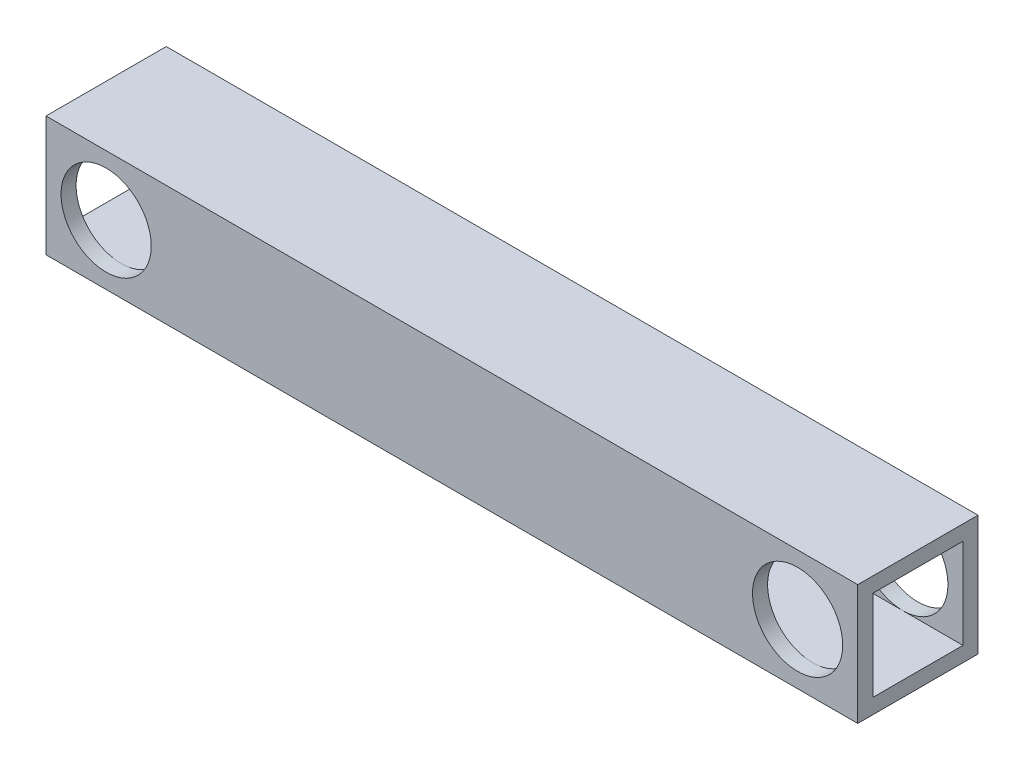
ISO-10303-21;
HEADER;
FILE_DESCRIPTION(('STEP AP214'),'2;1');
FILE_NAME('part.step','',(''),(''),'','','');
FILE_SCHEMA(('AUTOMOTIVE_DESIGN { 1 0 10303 214 1 1 1 1 }'));
ENDSEC;
DATA;
#1=APPLICATION_CONTEXT('core data for automotive mechanical design processes');
#2=APPLICATION_PROTOCOL_DEFINITION('international standard','automotive_design',2000,#1);
#3=PRODUCT_CONTEXT('',#1,'mechanical');
#4=PRODUCT('Part','Part','',(#3));
#5=PRODUCT_RELATED_PRODUCT_CATEGORY('part','',(#4));
#6=PRODUCT_DEFINITION_FORMATION('','',#4);
#7=PRODUCT_DEFINITION_CONTEXT('part definition',#1,'design');
#8=PRODUCT_DEFINITION('design','',#6,#7);
#9=PRODUCT_DEFINITION_SHAPE('','',#8);
#10=(LENGTH_UNIT() NAMED_UNIT(*) SI_UNIT(.MILLI.,.METRE.));
#11=(NAMED_UNIT(*) PLANE_ANGLE_UNIT() SI_UNIT($,.RADIAN.));
#12=(NAMED_UNIT(*) SI_UNIT($,.STERADIAN.) SOLID_ANGLE_UNIT());
#13=UNCERTAINTY_MEASURE_WITH_UNIT(LENGTH_MEASURE(1.E-05),#10,'distance_accuracy_value','');
#14=(GEOMETRIC_REPRESENTATION_CONTEXT(3) GLOBAL_UNCERTAINTY_ASSIGNED_CONTEXT((#13)) GLOBAL_UNIT_ASSIGNED_CONTEXT((#10,
#11,#12)) REPRESENTATION_CONTEXT('',''));
#15=CARTESIAN_POINT('',(0.,0.,0.));
#16=DIRECTION('',(0.,0.,1.));
#17=DIRECTION('',(1.,0.,0.));
#18=AXIS2_PLACEMENT_3D('',#15,#16,#17);
#19=CARTESIAN_POINT('',(0.,0.,25.4));
#20=DIRECTION('',(0.,0.,-1.));
#21=DIRECTION('',(-1.,0.,0.));
#22=AXIS2_PLACEMENT_3D('',#19,#20,#21);
#23=CYLINDRICAL_SURFACE('',#22,9.525);
#24=CARTESIAN_POINT('',(0.,0.,22.225));
#25=DIRECTION('',(0.,0.,1.));
#26=DIRECTION('',(1.,0.,0.));
#27=AXIS2_PLACEMENT_3D('',#24,#25,#26);
#28=CIRCLE('',#27,9.525);
#29=CARTESIAN_POINT('',(0.,9.525,22.225));
#30=VERTEX_POINT('',#29);
#31=CARTESIAN_POINT('',(0.,-9.525,22.225));
#32=VERTEX_POINT('',#31);
#33=EDGE_CURVE('E175',#30,#32,#28,.T.);
#34=ORIENTED_EDGE('',*,*,#33,.F.);
#35=EDGE_CURVE('E173',#32,#30,#28,.T.);
#36=ORIENTED_EDGE('',*,*,#35,.F.);
#37=EDGE_LOOP('',(#34,#36));
#38=FACE_BOUND('',#37,.T.);
#39=CARTESIAN_POINT('',(0.,0.,25.4));
#40=DIRECTION('',(0.,0.,1.));
#41=DIRECTION('',(1.,0.,0.));
#42=AXIS2_PLACEMENT_3D('',#39,#40,#41);
#43=CIRCLE('',#42,9.525);
#44=CARTESIAN_POINT('',(9.525,0.,25.4));
#45=VERTEX_POINT('',#44);
#46=EDGE_CURVE('E183',#45,#45,#43,.T.);
#47=ORIENTED_EDGE('',*,*,#46,.T.);
#48=EDGE_LOOP('',(#47));
#49=FACE_BOUND('',#48,.T.);
#50=ADVANCED_FACE('F33',(#38,#49),#23,.F.);
#51=CARTESIAN_POINT('',(146.05,0.,25.4));
#52=DIRECTION('',(0.,0.,-1.));
#53=DIRECTION('',(-1.,0.,0.));
#54=AXIS2_PLACEMENT_3D('',#51,#52,#53);
#55=CYLINDRICAL_SURFACE('',#54,9.525);
#56=CARTESIAN_POINT('',(146.05,0.,22.225));
#57=DIRECTION('',(0.,0.,1.));
#58=DIRECTION('',(1.,0.,0.));
#59=AXIS2_PLACEMENT_3D('',#56,#57,#58);
#60=CIRCLE('',#59,9.525);
#61=CARTESIAN_POINT('',(146.05,9.525,22.225));
#62=VERTEX_POINT('',#61);
#63=CARTESIAN_POINT('',(146.05,-9.525,22.225));
#64=VERTEX_POINT('',#63);
#65=EDGE_CURVE('E11',#62,#64,#60,.T.);
#66=ORIENTED_EDGE('',*,*,#65,.F.);
#67=EDGE_CURVE('E37',#64,#62,#60,.T.);
#68=ORIENTED_EDGE('',*,*,#67,.F.);
#69=EDGE_LOOP('',(#66,#68));
#70=FACE_BOUND('',#69,.T.);
#71=CARTESIAN_POINT('',(146.05,0.,25.4));
#72=DIRECTION('',(0.,0.,1.));
#73=DIRECTION('',(1.,0.,0.));
#74=AXIS2_PLACEMENT_3D('',#71,#72,#73);
#75=CIRCLE('',#74,9.525);
#76=CARTESIAN_POINT('',(155.575,0.,25.4));
#77=VERTEX_POINT('',#76);
#78=EDGE_CURVE('E176',#77,#77,#75,.T.);
#79=ORIENTED_EDGE('',*,*,#78,.T.);
#80=EDGE_LOOP('',(#79));
#81=FACE_BOUND('',#80,.T.);
#82=ADVANCED_FACE('F242',(#70,#81),#55,.F.);
#83=CARTESIAN_POINT('',(0.,0.,25.4));
#84=DIRECTION('',(0.,0.,-1.));
#85=DIRECTION('',(-1.,0.,0.));
#86=AXIS2_PLACEMENT_3D('',#83,#84,#85);
#87=PLANE('',#86);
#88=ORIENTED_EDGE('',*,*,#46,.F.);
#89=EDGE_LOOP('',(#88));
#90=FACE_BOUND('',#89,.T.);
#91=DIRECTION('',(0.,1.,0.));
#92=VECTOR('',#91,1.);
#93=CARTESIAN_POINT('',(158.75,12.7,25.4));
#94=LINE('',#93,#92);
#95=CARTESIAN_POINT('',(158.75,-12.7,25.4));
#96=VERTEX_POINT('',#95);
#97=CARTESIAN_POINT('',(158.75,12.7,25.4));
#98=VERTEX_POINT('',#97);
#99=EDGE_CURVE('E189',#96,#98,#94,.T.);
#100=ORIENTED_EDGE('',*,*,#99,.T.);
#101=DIRECTION('',(-1.,0.,0.));
#102=VECTOR('',#101,1.);
#103=CARTESIAN_POINT('',(158.75,12.7,25.4));
#104=LINE('',#103,#102);
#105=CARTESIAN_POINT('',(-12.7,12.7,25.4));
#106=VERTEX_POINT('',#105);
#107=EDGE_CURVE('E192',#98,#106,#104,.T.);
#108=ORIENTED_EDGE('',*,*,#107,.T.);
#109=DIRECTION('',(0.,-1.,0.));
#110=VECTOR('',#109,1.);
#111=CARTESIAN_POINT('',(-12.7,12.7,25.4));
#112=LINE('',#111,#110);
#113=CARTESIAN_POINT('',(-12.7,-12.7,25.4));
#114=VERTEX_POINT('',#113);
#115=EDGE_CURVE('E195',#106,#114,#112,.T.);
#116=ORIENTED_EDGE('',*,*,#115,.T.);
#117=DIRECTION('',(1.,0.,0.));
#118=VECTOR('',#117,1.);
#119=CARTESIAN_POINT('',(158.75,-12.7,25.4));
#120=LINE('',#119,#118);
#121=EDGE_CURVE('E197',#114,#96,#120,.T.);
#122=ORIENTED_EDGE('',*,*,#121,.T.);
#123=EDGE_LOOP('',(#100,#108,#116,#122));
#124=FACE_BOUND('',#123,.T.);
#125=ORIENTED_EDGE('',*,*,#78,.F.);
#126=EDGE_LOOP('',(#125));
#127=FACE_BOUND('',#126,.T.);
#128=ADVANCED_FACE('F245',(#90,#124,#127),#87,.F.);
#129=CARTESIAN_POINT('',(0.,0.,0.));
#130=DIRECTION('',(0.,0.,-1.));
#131=DIRECTION('',(-1.,0.,0.));
#132=AXIS2_PLACEMENT_3D('',#129,#130,#131);
#133=PLANE('',#132);
#134=CARTESIAN_POINT('',(0.,0.,0.));
#135=DIRECTION('',(0.,0.,1.));
#136=DIRECTION('',(1.,0.,0.));
#137=AXIS2_PLACEMENT_3D('',#134,#135,#136);
#138=CIRCLE('',#137,9.525);
#139=CARTESIAN_POINT('',(9.525,0.,0.));
#140=VERTEX_POINT('',#139);
#141=EDGE_CURVE('E179',#140,#140,#138,.T.);
#142=ORIENTED_EDGE('',*,*,#141,.T.);
#143=EDGE_LOOP('',(#142));
#144=FACE_BOUND('',#143,.T.);
#145=DIRECTION('',(0.,1.,0.));
#146=VECTOR('',#145,1.);
#147=CARTESIAN_POINT('',(158.75,12.7,0.));
#148=LINE('',#147,#146);
#149=CARTESIAN_POINT('',(158.75,-12.7,0.));
#150=VERTEX_POINT('',#149);
#151=CARTESIAN_POINT('',(158.75,12.7,0.));
#152=VERTEX_POINT('',#151);
#153=EDGE_CURVE('E186',#150,#152,#148,.T.);
#154=ORIENTED_EDGE('',*,*,#153,.F.);
#155=DIRECTION('',(1.,0.,0.));
#156=VECTOR('',#155,1.);
#157=CARTESIAN_POINT('',(158.75,-12.7,0.));
#158=LINE('',#157,#156);
#159=CARTESIAN_POINT('',(-12.7,-12.7,0.));
#160=VERTEX_POINT('',#159);
#161=EDGE_CURVE('E193',#160,#150,#158,.T.);
#162=ORIENTED_EDGE('',*,*,#161,.F.);
#163=DIRECTION('',(0.,-1.,0.));
#164=VECTOR('',#163,1.);
#165=CARTESIAN_POINT('',(-12.7,12.7,0.));
#166=LINE('',#165,#164);
#167=CARTESIAN_POINT('',(-12.7,12.7,0.));
#168=VERTEX_POINT('',#167);
#169=EDGE_CURVE('E204',#168,#160,#166,.T.);
#170=ORIENTED_EDGE('',*,*,#169,.F.);
#171=DIRECTION('',(-1.,0.,0.));
#172=VECTOR('',#171,1.);
#173=CARTESIAN_POINT('',(158.75,12.7,0.));
#174=LINE('',#173,#172);
#175=EDGE_CURVE('E202',#152,#168,#174,.T.);
#176=ORIENTED_EDGE('',*,*,#175,.F.);
#177=EDGE_LOOP('',(#154,#162,#170,#176));
#178=FACE_BOUND('',#177,.T.);
#179=CARTESIAN_POINT('',(146.05,0.,0.));
#180=DIRECTION('',(0.,0.,1.));
#181=DIRECTION('',(1.,0.,0.));
#182=AXIS2_PLACEMENT_3D('',#179,#180,#181);
#183=CIRCLE('',#182,9.525);
#184=CARTESIAN_POINT('',(155.575,0.,0.));
#185=VERTEX_POINT('',#184);
#186=EDGE_CURVE('E180',#185,#185,#183,.T.);
#187=ORIENTED_EDGE('',*,*,#186,.T.);
#188=EDGE_LOOP('',(#187));
#189=FACE_BOUND('',#188,.T.);
#190=ADVANCED_FACE('F251',(#144,#178,#189),#133,.T.);
#191=CARTESIAN_POINT('',(158.75,12.7,25.4));
#192=DIRECTION('',(-1.,0.,0.));
#193=DIRECTION('',(0.,0.,1.));
#194=AXIS2_PLACEMENT_3D('',#191,#192,#193);
#195=PLANE('',#194);
#196=DIRECTION('',(0.,1.,0.));
#197=VECTOR('',#196,1.);
#198=CARTESIAN_POINT('',(158.75,-9.525,3.175));
#199=LINE('',#198,#197);
#200=CARTESIAN_POINT('',(158.75,-9.525,3.175));
#201=VERTEX_POINT('',#200);
#202=CARTESIAN_POINT('',(158.75,9.525,3.175));
#203=VERTEX_POINT('',#202);
#204=EDGE_CURVE('E154',#201,#203,#199,.T.);
#205=ORIENTED_EDGE('',*,*,#204,.F.);
#206=DIRECTION('',(0.,0.,-1.));
#207=VECTOR('',#206,1.);
#208=CARTESIAN_POINT('',(158.75,-9.525,22.225));
#209=LINE('',#208,#207);
#210=CARTESIAN_POINT('',(158.75,-9.525,22.225));
#211=VERTEX_POINT('',#210);
#212=EDGE_CURVE('E48',#211,#201,#209,.T.);
#213=ORIENTED_EDGE('',*,*,#212,.F.);
#214=DIRECTION('',(0.,-1.,0.));
#215=VECTOR('',#214,1.);
#216=CARTESIAN_POINT('',(158.75,9.525,22.225));
#217=LINE('',#216,#215);
#218=CARTESIAN_POINT('',(158.75,9.525,22.225));
#219=VERTEX_POINT('',#218);
#220=EDGE_CURVE('E145',#219,#211,#217,.T.);
#221=ORIENTED_EDGE('',*,*,#220,.F.);
#222=DIRECTION('',(0.,0.,1.));
#223=VECTOR('',#222,1.);
#224=CARTESIAN_POINT('',(158.75,9.525,3.175));
#225=LINE('',#224,#223);
#226=EDGE_CURVE('E148',#203,#219,#225,.T.);
#227=ORIENTED_EDGE('',*,*,#226,.F.);
#228=EDGE_LOOP('',(#205,#213,#221,#227));
#229=FACE_BOUND('',#228,.T.);
#230=ORIENTED_EDGE('',*,*,#153,.T.);
#231=DIRECTION('',(0.,0.,-1.));
#232=VECTOR('',#231,1.);
#233=CARTESIAN_POINT('',(158.75,12.7,25.4));
#234=LINE('',#233,#232);
#235=EDGE_CURVE('E215',#98,#152,#234,.T.);
#236=ORIENTED_EDGE('',*,*,#235,.F.);
#237=ORIENTED_EDGE('',*,*,#99,.F.);
#238=DIRECTION('',(0.,0.,-1.));
#239=VECTOR('',#238,1.);
#240=CARTESIAN_POINT('',(158.75,-12.7,25.4));
#241=LINE('',#240,#239);
#242=EDGE_CURVE('E199',#96,#150,#241,.T.);
#243=ORIENTED_EDGE('',*,*,#242,.T.);
#244=EDGE_LOOP('',(#230,#236,#237,#243));
#245=FACE_BOUND('',#244,.T.);
#246=ADVANCED_FACE('F35',(#229,#245),#195,.F.);
#247=CARTESIAN_POINT('',(158.75,12.7,25.4));
#248=DIRECTION('',(0.,-1.,0.));
#249=DIRECTION('',(1.,0.,0.));
#250=AXIS2_PLACEMENT_3D('',#247,#248,#249);
#251=PLANE('',#250);
#252=ORIENTED_EDGE('',*,*,#175,.T.);
#253=DIRECTION('',(0.,0.,-1.));
#254=VECTOR('',#253,1.);
#255=CARTESIAN_POINT('',(-12.7,12.7,25.4));
#256=LINE('',#255,#254);
#257=EDGE_CURVE('E212',#106,#168,#256,.T.);
#258=ORIENTED_EDGE('',*,*,#257,.F.);
#259=ORIENTED_EDGE('',*,*,#107,.F.);
#260=ORIENTED_EDGE('',*,*,#235,.T.);
#261=EDGE_LOOP('',(#252,#258,#259,#260));
#262=FACE_BOUND('',#261,.T.);
#263=ADVANCED_FACE('F299',(#262),#251,.F.);
#264=CARTESIAN_POINT('',(-12.7,12.7,25.4));
#265=DIRECTION('',(1.,0.,0.));
#266=DIRECTION('',(0.,0.,-1.));
#267=AXIS2_PLACEMENT_3D('',#264,#265,#266);
#268=PLANE('',#267);
#269=DIRECTION('',(0.,-1.,0.));
#270=VECTOR('',#269,1.);
#271=CARTESIAN_POINT('',(-12.7,9.525,22.225));
#272=LINE('',#271,#270);
#273=CARTESIAN_POINT('',(-12.7,9.525,22.225));
#274=VERTEX_POINT('',#273);
#275=CARTESIAN_POINT('',(-12.7,-9.525,22.225));
#276=VERTEX_POINT('',#275);
#277=EDGE_CURVE('E144',#274,#276,#272,.T.);
#278=ORIENTED_EDGE('',*,*,#277,.T.);
#279=DIRECTION('',(0.,0.,-1.));
#280=VECTOR('',#279,1.);
#281=CARTESIAN_POINT('',(-12.7,-9.525,22.225));
#282=LINE('',#281,#280);
#283=CARTESIAN_POINT('',(-12.7,-9.525,3.175));
#284=VERTEX_POINT('',#283);
#285=EDGE_CURVE('E127',#276,#284,#282,.T.);
#286=ORIENTED_EDGE('',*,*,#285,.T.);
#287=DIRECTION('',(0.,1.,0.));
#288=VECTOR('',#287,1.);
#289=CARTESIAN_POINT('',(-12.7,-9.525,3.175));
#290=LINE('',#289,#288);
#291=CARTESIAN_POINT('',(-12.7,9.525,3.175));
#292=VERTEX_POINT('',#291);
#293=EDGE_CURVE('E136',#284,#292,#290,.T.);
#294=ORIENTED_EDGE('',*,*,#293,.T.);
#295=DIRECTION('',(0.,0.,1.));
#296=VECTOR('',#295,1.);
#297=CARTESIAN_POINT('',(-12.7,9.525,3.175));
#298=LINE('',#297,#296);
#299=EDGE_CURVE('E56',#292,#274,#298,.T.);
#300=ORIENTED_EDGE('',*,*,#299,.T.);
#301=EDGE_LOOP('',(#278,#286,#294,#300));
#302=FACE_BOUND('',#301,.T.);
#303=ORIENTED_EDGE('',*,*,#169,.T.);
#304=DIRECTION('',(0.,0.,-1.));
#305=VECTOR('',#304,1.);
#306=CARTESIAN_POINT('',(-12.7,-12.7,25.4));
#307=LINE('',#306,#305);
#308=EDGE_CURVE('E209',#114,#160,#307,.T.);
#309=ORIENTED_EDGE('',*,*,#308,.F.);
#310=ORIENTED_EDGE('',*,*,#115,.F.);
#311=ORIENTED_EDGE('',*,*,#257,.T.);
#312=EDGE_LOOP('',(#303,#309,#310,#311));
#313=FACE_BOUND('',#312,.T.);
#314=ADVANCED_FACE('F141',(#302,#313),#268,.F.);
#315=CARTESIAN_POINT('',(158.75,-12.7,25.4));
#316=DIRECTION('',(0.,1.,0.));
#317=DIRECTION('',(-1.,0.,0.));
#318=AXIS2_PLACEMENT_3D('',#315,#316,#317);
#319=PLANE('',#318);
#320=ORIENTED_EDGE('',*,*,#161,.T.);
#321=ORIENTED_EDGE('',*,*,#242,.F.);
#322=ORIENTED_EDGE('',*,*,#121,.F.);
#323=ORIENTED_EDGE('',*,*,#308,.T.);
#324=EDGE_LOOP('',(#320,#321,#322,#323));
#325=FACE_BOUND('',#324,.T.);
#326=ADVANCED_FACE('F270',(#325),#319,.F.);
#327=CARTESIAN_POINT('',(0.,0.,3.175));
#328=DIRECTION('',(0.,0.,-1.));
#329=DIRECTION('',(-1.,0.,0.));
#330=AXIS2_PLACEMENT_3D('',#327,#328,#329);
#331=CIRCLE('',#330,9.525);
#332=CARTESIAN_POINT('',(0.,9.525,3.175));
#333=VERTEX_POINT('',#332);
#334=CARTESIAN_POINT('',(0.,-9.525,3.175));
#335=VERTEX_POINT('',#334);
#336=EDGE_CURVE('E172',#333,#335,#331,.T.);
#337=ORIENTED_EDGE('',*,*,#336,.F.);
#338=EDGE_CURVE('E161',#335,#333,#331,.T.);
#339=ORIENTED_EDGE('',*,*,#338,.F.);
#340=EDGE_LOOP('',(#337,#339));
#341=FACE_BOUND('',#340,.T.);
#342=ORIENTED_EDGE('',*,*,#141,.F.);
#343=EDGE_LOOP('',(#342));
#344=FACE_BOUND('',#343,.T.);
#345=ADVANCED_FACE('F264',(#341,#344),#23,.F.);
#346=CARTESIAN_POINT('',(146.05,0.,3.175));
#347=DIRECTION('',(0.,0.,-1.));
#348=DIRECTION('',(-1.,0.,0.));
#349=AXIS2_PLACEMENT_3D('',#346,#347,#348);
#350=CIRCLE('',#349,9.525);
#351=CARTESIAN_POINT('',(146.05,9.525,3.175));
#352=VERTEX_POINT('',#351);
#353=CARTESIAN_POINT('',(146.05,-9.525,3.175));
#354=VERTEX_POINT('',#353);
#355=EDGE_CURVE('E218',#352,#354,#350,.T.);
#356=ORIENTED_EDGE('',*,*,#355,.F.);
#357=EDGE_CURVE('E217',#354,#352,#350,.T.);
#358=ORIENTED_EDGE('',*,*,#357,.F.);
#359=EDGE_LOOP('',(#356,#358));
#360=FACE_BOUND('',#359,.T.);
#361=ORIENTED_EDGE('',*,*,#186,.F.);
#362=EDGE_LOOP('',(#361));
#363=FACE_BOUND('',#362,.T.);
#364=ADVANCED_FACE('F247',(#360,#363),#55,.F.);
#365=CARTESIAN_POINT('',(-12.7,-9.525,22.225));
#366=DIRECTION('',(0.,-1.,0.));
#367=DIRECTION('',(0.,0.,-1.));
#368=AXIS2_PLACEMENT_3D('',#365,#366,#367);
#369=PLANE('',#368);
#370=DIRECTION('',(1.,0.,0.));
#371=VECTOR('',#370,1.);
#372=CARTESIAN_POINT('',(-12.7,-9.525,22.225));
#373=LINE('',#372,#371);
#374=EDGE_CURVE('E162',#32,#64,#373,.T.);
#375=ORIENTED_EDGE('',*,*,#374,.T.);
#376=EDGE_CURVE('E163',#64,#211,#373,.T.);
#377=ORIENTED_EDGE('',*,*,#376,.T.);
#378=ORIENTED_EDGE('',*,*,#212,.T.);
#379=DIRECTION('',(1.,0.,0.));
#380=VECTOR('',#379,1.);
#381=CARTESIAN_POINT('',(-12.7,-9.525,3.175));
#382=LINE('',#381,#380);
#383=EDGE_CURVE('E134',#354,#201,#382,.T.);
#384=ORIENTED_EDGE('',*,*,#383,.F.);
#385=EDGE_CURVE('E129',#335,#354,#382,.T.);
#386=ORIENTED_EDGE('',*,*,#385,.F.);
#387=EDGE_CURVE('E123',#284,#335,#382,.T.);
#388=ORIENTED_EDGE('',*,*,#387,.F.);
#389=ORIENTED_EDGE('',*,*,#285,.F.);
#390=EDGE_CURVE('E159',#276,#32,#373,.T.);
#391=ORIENTED_EDGE('',*,*,#390,.T.);
#392=EDGE_LOOP('',(#375,#377,#378,#384,#386,#388,#389,#391));
#393=FACE_BOUND('',#392,.T.);
#394=ADVANCED_FACE('F125',(#393),#369,.F.);
#395=CARTESIAN_POINT('',(-12.7,9.525,22.225));
#396=DIRECTION('',(0.,0.,1.));
#397=DIRECTION('',(1.,0.,0.));
#398=AXIS2_PLACEMENT_3D('',#395,#396,#397);
#399=PLANE('',#398);
#400=ORIENTED_EDGE('',*,*,#33,.T.);
#401=ORIENTED_EDGE('',*,*,#390,.F.);
#402=ORIENTED_EDGE('',*,*,#277,.F.);
#403=DIRECTION('',(1.,0.,0.));
#404=VECTOR('',#403,1.);
#405=CARTESIAN_POINT('',(-12.7,9.525,22.225));
#406=LINE('',#405,#404);
#407=EDGE_CURVE('E164',#274,#30,#406,.T.);
#408=ORIENTED_EDGE('',*,*,#407,.T.);
#409=EDGE_LOOP('',(#400,#401,#402,#408));
#410=FACE_BOUND('',#409,.T.);
#411=ADVANCED_FACE('F326',(#410),#399,.F.);
#412=ORIENTED_EDGE('',*,*,#35,.T.);
#413=EDGE_CURVE('E167',#30,#62,#406,.T.);
#414=ORIENTED_EDGE('',*,*,#413,.T.);
#415=ORIENTED_EDGE('',*,*,#65,.T.);
#416=ORIENTED_EDGE('',*,*,#374,.F.);
#417=EDGE_LOOP('',(#412,#414,#415,#416));
#418=FACE_BOUND('',#417,.T.);
#419=ADVANCED_FACE('F239',(#418),#399,.F.);
#420=CARTESIAN_POINT('',(-12.7,9.525,3.175));
#421=DIRECTION('',(0.,1.,0.));
#422=DIRECTION('',(0.,0.,1.));
#423=AXIS2_PLACEMENT_3D('',#420,#421,#422);
#424=PLANE('',#423);
#425=ORIENTED_EDGE('',*,*,#407,.F.);
#426=ORIENTED_EDGE('',*,*,#299,.F.);
#427=DIRECTION('',(1.,0.,0.));
#428=VECTOR('',#427,1.);
#429=CARTESIAN_POINT('',(-12.7,9.525,3.175));
#430=LINE('',#429,#428);
#431=EDGE_CURVE('E138',#292,#333,#430,.T.);
#432=ORIENTED_EDGE('',*,*,#431,.T.);
#433=EDGE_CURVE('E169',#333,#352,#430,.T.);
#434=ORIENTED_EDGE('',*,*,#433,.T.);
#435=EDGE_CURVE('E132',#352,#203,#430,.T.);
#436=ORIENTED_EDGE('',*,*,#435,.T.);
#437=ORIENTED_EDGE('',*,*,#226,.T.);
#438=EDGE_CURVE('E168',#62,#219,#406,.T.);
#439=ORIENTED_EDGE('',*,*,#438,.F.);
#440=ORIENTED_EDGE('',*,*,#413,.F.);
#441=EDGE_LOOP('',(#425,#426,#432,#434,#436,#437,#439,#440));
#442=FACE_BOUND('',#441,.T.);
#443=ADVANCED_FACE('F235',(#442),#424,.F.);
#444=CARTESIAN_POINT('',(-12.7,-9.525,3.175));
#445=DIRECTION('',(0.,0.,-1.));
#446=DIRECTION('',(-1.,0.,0.));
#447=AXIS2_PLACEMENT_3D('',#444,#445,#446);
#448=PLANE('',#447);
#449=ORIENTED_EDGE('',*,*,#336,.T.);
#450=ORIENTED_EDGE('',*,*,#385,.T.);
#451=ORIENTED_EDGE('',*,*,#357,.T.);
#452=ORIENTED_EDGE('',*,*,#433,.F.);
#453=EDGE_LOOP('',(#449,#450,#451,#452));
#454=FACE_BOUND('',#453,.T.);
#455=ADVANCED_FACE('F312',(#454),#448,.F.);
#456=ORIENTED_EDGE('',*,*,#355,.T.);
#457=ORIENTED_EDGE('',*,*,#383,.T.);
#458=ORIENTED_EDGE('',*,*,#204,.T.);
#459=ORIENTED_EDGE('',*,*,#435,.F.);
#460=EDGE_LOOP('',(#456,#457,#458,#459));
#461=FACE_BOUND('',#460,.T.);
#462=ADVANCED_FACE('F310',(#461),#448,.F.);
#463=ORIENTED_EDGE('',*,*,#67,.T.);
#464=ORIENTED_EDGE('',*,*,#438,.T.);
#465=ORIENTED_EDGE('',*,*,#220,.T.);
#466=ORIENTED_EDGE('',*,*,#376,.F.);
#467=EDGE_LOOP('',(#463,#464,#465,#466));
#468=FACE_BOUND('',#467,.T.);
#469=ADVANCED_FACE('F230',(#468),#399,.F.);
#470=ORIENTED_EDGE('',*,*,#338,.T.);
#471=ORIENTED_EDGE('',*,*,#431,.F.);
#472=ORIENTED_EDGE('',*,*,#293,.F.);
#473=ORIENTED_EDGE('',*,*,#387,.T.);
#474=EDGE_LOOP('',(#470,#471,#472,#473));
#475=FACE_BOUND('',#474,.T.);
#476=ADVANCED_FACE('F137',(#475),#448,.F.);
#477=CLOSED_SHELL('',(#50,#82,#128,#190,#246,#263,#314,#326,#345,#364,#394,#411,#419,#443,#455,
#462,#469,#476));
#478=MANIFOLD_SOLID_BREP('B2',#477);
#479=ADVANCED_BREP_SHAPE_REPRESENTATION('',(#18,#478),#14);
#480=SHAPE_DEFINITION_REPRESENTATION(#9,#479);
ENDSEC;
END-ISO-10303-21;
